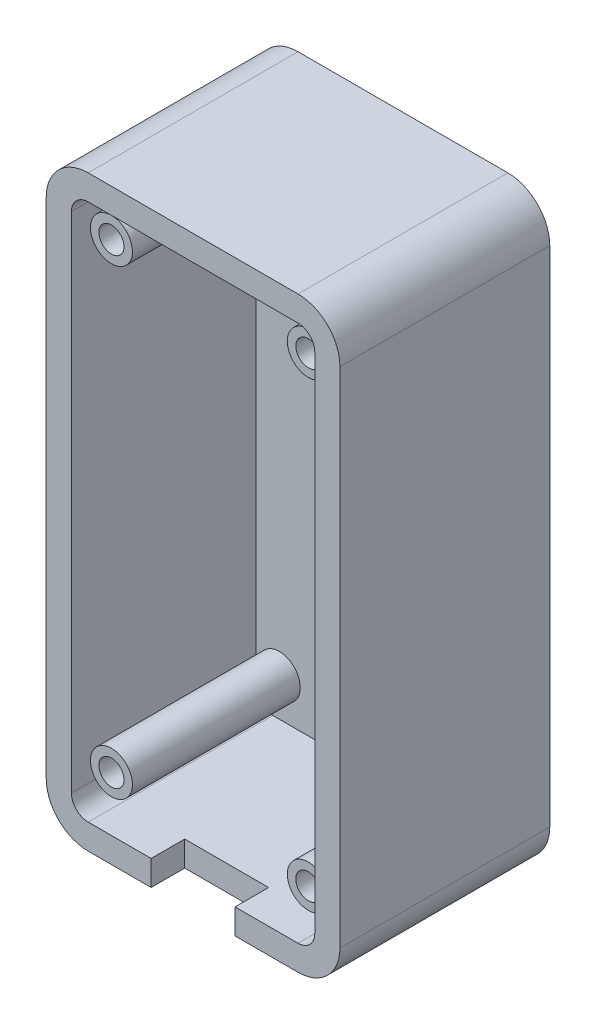
ISO-10303-21;
HEADER;
FILE_DESCRIPTION(('STEP AP214'),'2;1');
FILE_NAME('part.step','',(''),(''),'','','');
FILE_SCHEMA(('AUTOMOTIVE_DESIGN { 1 0 10303 214 1 1 1 1 }'));
ENDSEC;
DATA;
#1=APPLICATION_CONTEXT('core data for automotive mechanical design processes');
#2=APPLICATION_PROTOCOL_DEFINITION('international standard','automotive_design',2000,#1);
#3=PRODUCT_CONTEXT('',#1,'mechanical');
#4=PRODUCT('Part','Part','',(#3));
#5=PRODUCT_RELATED_PRODUCT_CATEGORY('part','',(#4));
#6=PRODUCT_DEFINITION_FORMATION('','',#4);
#7=PRODUCT_DEFINITION_CONTEXT('part definition',#1,'design');
#8=PRODUCT_DEFINITION('design','',#6,#7);
#9=PRODUCT_DEFINITION_SHAPE('','',#8);
#10=(LENGTH_UNIT() NAMED_UNIT(*) SI_UNIT(.MILLI.,.METRE.));
#11=(NAMED_UNIT(*) PLANE_ANGLE_UNIT() SI_UNIT($,.RADIAN.));
#12=(NAMED_UNIT(*) SI_UNIT($,.STERADIAN.) SOLID_ANGLE_UNIT());
#13=UNCERTAINTY_MEASURE_WITH_UNIT(LENGTH_MEASURE(1.E-05),#10,'distance_accuracy_value','');
#14=(GEOMETRIC_REPRESENTATION_CONTEXT(3) GLOBAL_UNCERTAINTY_ASSIGNED_CONTEXT((#13)) GLOBAL_UNIT_ASSIGNED_CONTEXT((#10,
#11,#12)) REPRESENTATION_CONTEXT('',''));
#15=CARTESIAN_POINT('',(0.,0.,0.));
#16=DIRECTION('',(0.,0.,1.));
#17=DIRECTION('',(1.,0.,0.));
#18=AXIS2_PLACEMENT_3D('',#15,#16,#17);
#19=CARTESIAN_POINT('',(-193.425196850394,0.,25.));
#20=DIRECTION('',(0.,1.,0.));
#21=DIRECTION('',(0.,0.,1.));
#22=AXIS2_PLACEMENT_3D('',#19,#20,#21);
#23=PLANE('',#22);
#24=DIRECTION('',(0.,0.,1.));
#25=VECTOR('',#24,1.);
#26=CARTESIAN_POINT('',(-175.925196850394,0.,25.));
#27=LINE('',#26,#25);
#28=CARTESIAN_POINT('',(-175.925196850394,0.,21.));
#29=VERTEX_POINT('',#28);
#30=CARTESIAN_POINT('',(-175.925196850394,0.,25.));
#31=VERTEX_POINT('',#30);
#32=EDGE_CURVE('E189',#29,#31,#27,.T.);
#33=ORIENTED_EDGE('',*,*,#32,.F.);
#34=DIRECTION('',(1.,0.,0.));
#35=VECTOR('',#34,1.);
#36=CARTESIAN_POINT('',(-193.425196850394,0.,21.));
#37=LINE('',#36,#35);
#38=CARTESIAN_POINT('',(-185.925196850394,0.,21.));
#39=VERTEX_POINT('',#38);
#40=EDGE_CURVE('E176',#39,#29,#37,.T.);
#41=ORIENTED_EDGE('',*,*,#40,.F.);
#42=DIRECTION('',(0.,0.,-1.));
#43=VECTOR('',#42,1.);
#44=CARTESIAN_POINT('',(-185.925196850394,0.,25.));
#45=LINE('',#44,#43);
#46=CARTESIAN_POINT('',(-185.925196850394,0.,25.));
#47=VERTEX_POINT('',#46);
#48=EDGE_CURVE('E169',#47,#39,#45,.T.);
#49=ORIENTED_EDGE('',*,*,#48,.F.);
#50=DIRECTION('',(1.,0.,0.));
#51=VECTOR('',#50,1.);
#52=CARTESIAN_POINT('',(-193.425196850394,0.,25.));
#53=LINE('',#52,#51);
#54=CARTESIAN_POINT('',(-193.425196850394,0.,25.));
#55=VERTEX_POINT('',#54);
#56=EDGE_CURVE('E295',#55,#47,#53,.T.);
#57=ORIENTED_EDGE('',*,*,#56,.F.);
#58=DIRECTION('',(0.,0.,-1.));
#59=VECTOR('',#58,1.);
#60=CARTESIAN_POINT('',(-193.425196850394,0.,25.));
#61=LINE('',#60,#59);
#62=CARTESIAN_POINT('',(-193.425196850394,0.,0.));
#63=VERTEX_POINT('',#62);
#64=EDGE_CURVE('E345',#55,#63,#61,.T.);
#65=ORIENTED_EDGE('',*,*,#64,.T.);
#66=DIRECTION('',(1.,0.,0.));
#67=VECTOR('',#66,1.);
#68=CARTESIAN_POINT('',(-193.425196850394,0.,0.));
#69=LINE('',#68,#67);
#70=CARTESIAN_POINT('',(-168.425196850394,0.,0.));
#71=VERTEX_POINT('',#70);
#72=EDGE_CURVE('E312',#63,#71,#69,.T.);
#73=ORIENTED_EDGE('',*,*,#72,.T.);
#74=DIRECTION('',(0.,0.,-1.));
#75=VECTOR('',#74,1.);
#76=CARTESIAN_POINT('',(-168.425196850394,0.,25.));
#77=LINE('',#76,#75);
#78=CARTESIAN_POINT('',(-168.425196850394,0.,25.));
#79=VERTEX_POINT('',#78);
#80=EDGE_CURVE('E342',#79,#71,#77,.T.);
#81=ORIENTED_EDGE('',*,*,#80,.F.);
#82=EDGE_CURVE('E293',#31,#79,#53,.T.);
#83=ORIENTED_EDGE('',*,*,#82,.F.);
#84=EDGE_LOOP('',(#33,#41,#49,#57,#65,#73,#81,#83));
#85=FACE_BOUND('',#84,.T.);
#86=ADVANCED_FACE('F33',(#85),#23,.F.);
#87=CARTESIAN_POINT('',(-193.425196850394,5.,25.));
#88=DIRECTION('',(0.,0.,1.));
#89=DIRECTION('',(1.,0.,0.));
#90=AXIS2_PLACEMENT_3D('',#87,#88,#89);
#91=PLANE('',#90);
#92=DIRECTION('',(1.,0.,0.));
#93=VECTOR('',#92,1.);
#94=CARTESIAN_POINT('',(-193.425196850394,3.,25.));
#95=LINE('',#94,#93);
#96=CARTESIAN_POINT('',(-175.925196850394,3.,25.));
#97=VERTEX_POINT('',#96);
#98=CARTESIAN_POINT('',(-168.425196850394,3.,25.));
#99=VERTEX_POINT('',#98);
#100=EDGE_CURVE('E275',#97,#99,#95,.T.);
#101=ORIENTED_EDGE('',*,*,#100,.F.);
#102=DIRECTION('',(0.,-1.,0.));
#103=VECTOR('',#102,1.);
#104=CARTESIAN_POINT('',(-175.925196850394,5.,25.));
#105=LINE('',#104,#103);
#106=EDGE_CURVE('E177',#97,#31,#105,.T.);
#107=ORIENTED_EDGE('',*,*,#106,.T.);
#108=ORIENTED_EDGE('',*,*,#82,.T.);
#109=CARTESIAN_POINT('',(-168.425196850394,5.,25.));
#110=DIRECTION('',(0.,0.,1.));
#111=DIRECTION('',(1.,0.,0.));
#112=AXIS2_PLACEMENT_3D('',#109,#110,#111);
#113=CIRCLE('',#112,5.);
#114=CARTESIAN_POINT('',(-163.425196850394,5.00000000000004,25.));
#115=VERTEX_POINT('',#114);
#116=EDGE_CURVE('E297',#79,#115,#113,.T.);
#117=ORIENTED_EDGE('',*,*,#116,.T.);
#118=DIRECTION('',(0.,1.,0.));
#119=VECTOR('',#118,1.);
#120=CARTESIAN_POINT('',(-163.425196850394,65.,25.));
#121=LINE('',#120,#119);
#122=CARTESIAN_POINT('',(-163.425196850394,65.,25.));
#123=VERTEX_POINT('',#122);
#124=EDGE_CURVE('E299',#115,#123,#121,.T.);
#125=ORIENTED_EDGE('',*,*,#124,.T.);
#126=CARTESIAN_POINT('',(-168.425196850394,65.,25.));
#127=DIRECTION('',(0.,0.,1.));
#128=DIRECTION('',(-1.,0.,0.));
#129=AXIS2_PLACEMENT_3D('',#126,#127,#128);
#130=CIRCLE('',#129,5.);
#131=CARTESIAN_POINT('',(-168.425196850394,70.,25.));
#132=VERTEX_POINT('',#131);
#133=EDGE_CURVE('E301',#123,#132,#130,.T.);
#134=ORIENTED_EDGE('',*,*,#133,.T.);
#135=DIRECTION('',(-1.,0.,0.));
#136=VECTOR('',#135,1.);
#137=CARTESIAN_POINT('',(-193.425196850394,70.,25.));
#138=LINE('',#137,#136);
#139=CARTESIAN_POINT('',(-193.425196850394,70.,25.));
#140=VERTEX_POINT('',#139);
#141=EDGE_CURVE('E303',#132,#140,#138,.T.);
#142=ORIENTED_EDGE('',*,*,#141,.T.);
#143=CARTESIAN_POINT('',(-193.425196850394,65.,25.));
#144=DIRECTION('',(0.,0.,1.));
#145=DIRECTION('',(1.,0.,0.));
#146=AXIS2_PLACEMENT_3D('',#143,#144,#145);
#147=CIRCLE('',#146,5.);
#148=CARTESIAN_POINT('',(-198.425196850394,65.,25.));
#149=VERTEX_POINT('',#148);
#150=EDGE_CURVE('E305',#140,#149,#147,.T.);
#151=ORIENTED_EDGE('',*,*,#150,.T.);
#152=DIRECTION('',(0.,-1.,0.));
#153=VECTOR('',#152,1.);
#154=CARTESIAN_POINT('',(-198.425196850394,65.,25.));
#155=LINE('',#154,#153);
#156=CARTESIAN_POINT('',(-198.425196850394,5.00000000000004,25.));
#157=VERTEX_POINT('',#156);
#158=EDGE_CURVE('E307',#149,#157,#155,.T.);
#159=ORIENTED_EDGE('',*,*,#158,.T.);
#160=CARTESIAN_POINT('',(-193.425196850394,5.,25.));
#161=DIRECTION('',(0.,0.,1.));
#162=DIRECTION('',(1.,0.,0.));
#163=AXIS2_PLACEMENT_3D('',#160,#161,#162);
#164=CIRCLE('',#163,5.);
#165=EDGE_CURVE('E290',#157,#55,#164,.T.);
#166=ORIENTED_EDGE('',*,*,#165,.T.);
#167=ORIENTED_EDGE('',*,*,#56,.T.);
#168=DIRECTION('',(0.,-1.,0.));
#169=VECTOR('',#168,1.);
#170=CARTESIAN_POINT('',(-185.925196850394,5.,25.));
#171=LINE('',#170,#169);
#172=CARTESIAN_POINT('',(-185.925196850394,3.,25.));
#173=VERTEX_POINT('',#172);
#174=EDGE_CURVE('E172',#173,#47,#171,.T.);
#175=ORIENTED_EDGE('',*,*,#174,.F.);
#176=CARTESIAN_POINT('',(-193.425196850394,3.,25.));
#177=VERTEX_POINT('',#176);
#178=EDGE_CURVE('E276',#177,#173,#95,.T.);
#179=ORIENTED_EDGE('',*,*,#178,.F.);
#180=CARTESIAN_POINT('',(-193.425196850394,5.,25.));
#181=DIRECTION('',(0.,0.,1.));
#182=DIRECTION('',(1.,0.,0.));
#183=AXIS2_PLACEMENT_3D('',#180,#181,#182);
#184=CIRCLE('',#183,2.);
#185=CARTESIAN_POINT('',(-195.425196850394,5.00000000000003,25.));
#186=VERTEX_POINT('',#185);
#187=EDGE_CURVE('E273',#186,#177,#184,.T.);
#188=ORIENTED_EDGE('',*,*,#187,.F.);
#189=DIRECTION('',(0.,-1.,0.));
#190=VECTOR('',#189,1.);
#191=CARTESIAN_POINT('',(-195.425196850394,65.,25.));
#192=LINE('',#191,#190);
#193=CARTESIAN_POINT('',(-195.425196850394,65.,25.));
#194=VERTEX_POINT('',#193);
#195=EDGE_CURVE('E244',#194,#186,#192,.T.);
#196=ORIENTED_EDGE('',*,*,#195,.F.);
#197=CARTESIAN_POINT('',(-193.425196850394,65.,25.));
#198=DIRECTION('',(0.,0.,1.));
#199=DIRECTION('',(1.,0.,0.));
#200=AXIS2_PLACEMENT_3D('',#197,#198,#199);
#201=CIRCLE('',#200,2.);
#202=CARTESIAN_POINT('',(-193.425196850394,67.,25.));
#203=VERTEX_POINT('',#202);
#204=EDGE_CURVE('E287',#203,#194,#201,.T.);
#205=ORIENTED_EDGE('',*,*,#204,.F.);
#206=DIRECTION('',(-1.,0.,0.));
#207=VECTOR('',#206,1.);
#208=CARTESIAN_POINT('',(-193.425196850394,67.,25.));
#209=LINE('',#208,#207);
#210=CARTESIAN_POINT('',(-168.425196850394,67.,25.));
#211=VERTEX_POINT('',#210);
#212=EDGE_CURVE('E285',#211,#203,#209,.T.);
#213=ORIENTED_EDGE('',*,*,#212,.F.);
#214=CARTESIAN_POINT('',(-168.425196850394,65.,25.));
#215=DIRECTION('',(0.,0.,1.));
#216=DIRECTION('',(1.,0.,0.));
#217=AXIS2_PLACEMENT_3D('',#214,#215,#216);
#218=CIRCLE('',#217,2.);
#219=CARTESIAN_POINT('',(-166.425196850394,65.,25.));
#220=VERTEX_POINT('',#219);
#221=EDGE_CURVE('E283',#220,#211,#218,.T.);
#222=ORIENTED_EDGE('',*,*,#221,.F.);
#223=DIRECTION('',(0.,1.,0.));
#224=VECTOR('',#223,1.);
#225=CARTESIAN_POINT('',(-166.425196850394,65.,25.));
#226=LINE('',#225,#224);
#227=CARTESIAN_POINT('',(-166.425196850394,5.00000000000001,25.));
#228=VERTEX_POINT('',#227);
#229=EDGE_CURVE('E281',#228,#220,#226,.T.);
#230=ORIENTED_EDGE('',*,*,#229,.F.);
#231=CARTESIAN_POINT('',(-168.425196850394,5.,25.));
#232=DIRECTION('',(0.,0.,1.));
#233=DIRECTION('',(1.,0.,0.));
#234=AXIS2_PLACEMENT_3D('',#231,#232,#233);
#235=CIRCLE('',#234,2.);
#236=EDGE_CURVE('E279',#99,#228,#235,.T.);
#237=ORIENTED_EDGE('',*,*,#236,.F.);
#238=EDGE_LOOP('',(#101,#107,#108,#117,#125,#134,#142,#151,#159,#166,#167,#175,#179,#188,#196,
#205,#213,#222,#230,#237));
#239=FACE_BOUND('',#238,.T.);
#240=ADVANCED_FACE('F365',(#239),#91,.T.);
#241=CARTESIAN_POINT('',(-193.425196850394,3.,25.));
#242=DIRECTION('',(0.,1.,0.));
#243=DIRECTION('',(0.,0.,1.));
#244=AXIS2_PLACEMENT_3D('',#241,#242,#243);
#245=PLANE('',#244);
#246=DIRECTION('',(1.,0.,0.));
#247=VECTOR('',#246,1.);
#248=CARTESIAN_POINT('',(-193.425196850394,3.,21.));
#249=LINE('',#248,#247);
#250=CARTESIAN_POINT('',(-185.925196850394,3.,21.));
#251=VERTEX_POINT('',#250);
#252=CARTESIAN_POINT('',(-175.925196850394,3.,21.));
#253=VERTEX_POINT('',#252);
#254=EDGE_CURVE('E41',#251,#253,#249,.T.);
#255=ORIENTED_EDGE('',*,*,#254,.T.);
#256=DIRECTION('',(0.,0.,1.));
#257=VECTOR('',#256,1.);
#258=CARTESIAN_POINT('',(-175.925196850394,3.,25.));
#259=LINE('',#258,#257);
#260=EDGE_CURVE('E11',#253,#97,#259,.T.);
#261=ORIENTED_EDGE('',*,*,#260,.T.);
#262=ORIENTED_EDGE('',*,*,#100,.T.);
#263=DIRECTION('',(0.,0.,-1.));
#264=VECTOR('',#263,1.);
#265=CARTESIAN_POINT('',(-168.425196850394,3.,25.));
#266=LINE('',#265,#264);
#267=CARTESIAN_POINT('',(-168.425196850394,3.,3.));
#268=VERTEX_POINT('',#267);
#269=EDGE_CURVE('E240',#99,#268,#266,.T.);
#270=ORIENTED_EDGE('',*,*,#269,.T.);
#271=DIRECTION('',(1.,0.,0.));
#272=VECTOR('',#271,1.);
#273=CARTESIAN_POINT('',(-193.425196850394,3.,3.));
#274=LINE('',#273,#272);
#275=CARTESIAN_POINT('',(-193.425196850394,3.,3.));
#276=VERTEX_POINT('',#275);
#277=EDGE_CURVE('E235',#276,#268,#274,.T.);
#278=ORIENTED_EDGE('',*,*,#277,.F.);
#279=DIRECTION('',(0.,0.,1.));
#280=VECTOR('',#279,1.);
#281=CARTESIAN_POINT('',(-193.425196850394,3.,25.));
#282=LINE('',#281,#280);
#283=EDGE_CURVE('E236',#177,#276,#282,.F.);
#284=ORIENTED_EDGE('',*,*,#283,.F.);
#285=ORIENTED_EDGE('',*,*,#178,.T.);
#286=DIRECTION('',(0.,0.,-1.));
#287=VECTOR('',#286,1.);
#288=CARTESIAN_POINT('',(-185.925196850394,3.,25.));
#289=LINE('',#288,#287);
#290=EDGE_CURVE('E348',#173,#251,#289,.T.);
#291=ORIENTED_EDGE('',*,*,#290,.T.);
#292=EDGE_LOOP('',(#255,#261,#262,#270,#278,#284,#285,#291));
#293=FACE_BOUND('',#292,.T.);
#294=ADVANCED_FACE('F360',(#293),#245,.T.);
#295=CARTESIAN_POINT('',(-193.425196850394,5.,25.));
#296=DIRECTION('',(0.,0.,-1.));
#297=DIRECTION('',(-1.,0.,0.));
#298=AXIS2_PLACEMENT_3D('',#295,#296,#297);
#299=CYLINDRICAL_SURFACE('',#298,5.);
#300=CARTESIAN_POINT('',(-193.425196850394,5.,0.));
#301=DIRECTION('',(0.,0.,1.));
#302=DIRECTION('',(1.,0.,0.));
#303=AXIS2_PLACEMENT_3D('',#300,#301,#302);
#304=CIRCLE('',#303,5.);
#305=CARTESIAN_POINT('',(-198.425196850394,5.00000000000004,0.));
#306=VERTEX_POINT('',#305);
#307=EDGE_CURVE('E239',#306,#63,#304,.T.);
#308=ORIENTED_EDGE('',*,*,#307,.T.);
#309=ORIENTED_EDGE('',*,*,#64,.F.);
#310=ORIENTED_EDGE('',*,*,#165,.F.);
#311=DIRECTION('',(0.,0.,-1.));
#312=VECTOR('',#311,1.);
#313=CARTESIAN_POINT('',(-198.425196850394,5.00000000000004,25.));
#314=LINE('',#313,#312);
#315=EDGE_CURVE('E309',#157,#306,#314,.T.);
#316=ORIENTED_EDGE('',*,*,#315,.T.);
#317=EDGE_LOOP('',(#308,#309,#310,#316));
#318=FACE_BOUND('',#317,.T.);
#319=ADVANCED_FACE('F35',(#318),#299,.T.);
#320=CARTESIAN_POINT('',(-168.425196850394,5.,25.));
#321=DIRECTION('',(0.,0.,-1.));
#322=DIRECTION('',(-1.,0.,0.));
#323=AXIS2_PLACEMENT_3D('',#320,#321,#322);
#324=CYLINDRICAL_SURFACE('',#323,5.);
#325=CARTESIAN_POINT('',(-168.425196850394,5.,0.));
#326=DIRECTION('',(0.,0.,1.));
#327=DIRECTION('',(1.,0.,0.));
#328=AXIS2_PLACEMENT_3D('',#325,#326,#327);
#329=CIRCLE('',#328,5.);
#330=CARTESIAN_POINT('',(-163.425196850394,5.00000000000004,0.));
#331=VERTEX_POINT('',#330);
#332=EDGE_CURVE('E314',#71,#331,#329,.T.);
#333=ORIENTED_EDGE('',*,*,#332,.T.);
#334=DIRECTION('',(0.,0.,-1.));
#335=VECTOR('',#334,1.);
#336=CARTESIAN_POINT('',(-163.425196850394,5.00000000000004,25.));
#337=LINE('',#336,#335);
#338=EDGE_CURVE('E339',#115,#331,#337,.T.);
#339=ORIENTED_EDGE('',*,*,#338,.F.);
#340=ORIENTED_EDGE('',*,*,#116,.F.);
#341=ORIENTED_EDGE('',*,*,#80,.T.);
#342=EDGE_LOOP('',(#333,#339,#340,#341));
#343=FACE_BOUND('',#342,.T.);
#344=ADVANCED_FACE('F377',(#343),#324,.T.);
#345=CARTESIAN_POINT('',(-163.425196850394,65.,25.));
#346=DIRECTION('',(-1.,0.,0.));
#347=DIRECTION('',(0.,-1.,0.));
#348=AXIS2_PLACEMENT_3D('',#345,#346,#347);
#349=PLANE('',#348);
#350=DIRECTION('',(0.,1.,0.));
#351=VECTOR('',#350,1.);
#352=CARTESIAN_POINT('',(-163.425196850394,65.,0.));
#353=LINE('',#352,#351);
#354=CARTESIAN_POINT('',(-163.425196850394,65.,0.));
#355=VERTEX_POINT('',#354);
#356=EDGE_CURVE('E316',#331,#355,#353,.T.);
#357=ORIENTED_EDGE('',*,*,#356,.T.);
#358=DIRECTION('',(0.,0.,-1.));
#359=VECTOR('',#358,1.);
#360=CARTESIAN_POINT('',(-163.425196850394,65.,25.));
#361=LINE('',#360,#359);
#362=EDGE_CURVE('E336',#123,#355,#361,.T.);
#363=ORIENTED_EDGE('',*,*,#362,.F.);
#364=ORIENTED_EDGE('',*,*,#124,.F.);
#365=ORIENTED_EDGE('',*,*,#338,.T.);
#366=EDGE_LOOP('',(#357,#363,#364,#365));
#367=FACE_BOUND('',#366,.T.);
#368=ADVANCED_FACE('F383',(#367),#349,.F.);
#369=CARTESIAN_POINT('',(-168.425196850394,65.,25.));
#370=DIRECTION('',(0.,0.,-1.));
#371=DIRECTION('',(-1.,0.,0.));
#372=AXIS2_PLACEMENT_3D('',#369,#370,#371);
#373=CYLINDRICAL_SURFACE('',#372,5.);
#374=CARTESIAN_POINT('',(-168.425196850394,65.,0.));
#375=DIRECTION('',(0.,0.,1.));
#376=DIRECTION('',(-1.,0.,0.));
#377=AXIS2_PLACEMENT_3D('',#374,#375,#376);
#378=CIRCLE('',#377,5.);
#379=CARTESIAN_POINT('',(-168.425196850394,70.,0.));
#380=VERTEX_POINT('',#379);
#381=EDGE_CURVE('E318',#355,#380,#378,.T.);
#382=ORIENTED_EDGE('',*,*,#381,.T.);
#383=DIRECTION('',(0.,0.,-1.));
#384=VECTOR('',#383,1.);
#385=CARTESIAN_POINT('',(-168.425196850394,70.,25.));
#386=LINE('',#385,#384);
#387=EDGE_CURVE('E333',#132,#380,#386,.T.);
#388=ORIENTED_EDGE('',*,*,#387,.F.);
#389=ORIENTED_EDGE('',*,*,#133,.F.);
#390=ORIENTED_EDGE('',*,*,#362,.T.);
#391=EDGE_LOOP('',(#382,#388,#389,#390));
#392=FACE_BOUND('',#391,.T.);
#393=ADVANCED_FACE('F387',(#392),#373,.T.);
#394=CARTESIAN_POINT('',(-193.425196850394,70.,25.));
#395=DIRECTION('',(0.,-1.,0.));
#396=DIRECTION('',(0.,0.,-1.));
#397=AXIS2_PLACEMENT_3D('',#394,#395,#396);
#398=PLANE('',#397);
#399=DIRECTION('',(-1.,0.,0.));
#400=VECTOR('',#399,1.);
#401=CARTESIAN_POINT('',(-193.425196850394,70.,0.));
#402=LINE('',#401,#400);
#403=CARTESIAN_POINT('',(-193.425196850394,70.,0.));
#404=VERTEX_POINT('',#403);
#405=EDGE_CURVE('E320',#380,#404,#402,.T.);
#406=ORIENTED_EDGE('',*,*,#405,.T.);
#407=DIRECTION('',(0.,0.,-1.));
#408=VECTOR('',#407,1.);
#409=CARTESIAN_POINT('',(-193.425196850394,70.,25.));
#410=LINE('',#409,#408);
#411=EDGE_CURVE('E330',#140,#404,#410,.T.);
#412=ORIENTED_EDGE('',*,*,#411,.F.);
#413=ORIENTED_EDGE('',*,*,#141,.F.);
#414=ORIENTED_EDGE('',*,*,#387,.T.);
#415=EDGE_LOOP('',(#406,#412,#413,#414));
#416=FACE_BOUND('',#415,.T.);
#417=ADVANCED_FACE('F392',(#416),#398,.F.);
#418=CARTESIAN_POINT('',(-193.425196850394,65.,25.));
#419=DIRECTION('',(0.,0.,-1.));
#420=DIRECTION('',(-1.,0.,0.));
#421=AXIS2_PLACEMENT_3D('',#418,#419,#420);
#422=CYLINDRICAL_SURFACE('',#421,5.);
#423=CARTESIAN_POINT('',(-193.425196850394,65.,0.));
#424=DIRECTION('',(0.,0.,1.));
#425=DIRECTION('',(1.,0.,0.));
#426=AXIS2_PLACEMENT_3D('',#423,#424,#425);
#427=CIRCLE('',#426,5.);
#428=CARTESIAN_POINT('',(-198.425196850394,65.,0.));
#429=VERTEX_POINT('',#428);
#430=EDGE_CURVE('E322',#404,#429,#427,.T.);
#431=ORIENTED_EDGE('',*,*,#430,.T.);
#432=DIRECTION('',(0.,0.,-1.));
#433=VECTOR('',#432,1.);
#434=CARTESIAN_POINT('',(-198.425196850394,65.,25.));
#435=LINE('',#434,#433);
#436=EDGE_CURVE('E327',#149,#429,#435,.T.);
#437=ORIENTED_EDGE('',*,*,#436,.F.);
#438=ORIENTED_EDGE('',*,*,#150,.F.);
#439=ORIENTED_EDGE('',*,*,#411,.T.);
#440=EDGE_LOOP('',(#431,#437,#438,#439));
#441=FACE_BOUND('',#440,.T.);
#442=ADVANCED_FACE('F398',(#441),#422,.T.);
#443=CARTESIAN_POINT('',(-198.425196850394,65.,25.));
#444=DIRECTION('',(1.,0.,0.));
#445=DIRECTION('',(0.,0.,-1.));
#446=AXIS2_PLACEMENT_3D('',#443,#444,#445);
#447=PLANE('',#446);
#448=DIRECTION('',(0.,-1.,0.));
#449=VECTOR('',#448,1.);
#450=CARTESIAN_POINT('',(-198.425196850394,65.,0.));
#451=LINE('',#450,#449);
#452=EDGE_CURVE('E294',#429,#306,#451,.T.);
#453=ORIENTED_EDGE('',*,*,#452,.T.);
#454=ORIENTED_EDGE('',*,*,#315,.F.);
#455=ORIENTED_EDGE('',*,*,#158,.F.);
#456=ORIENTED_EDGE('',*,*,#436,.T.);
#457=EDGE_LOOP('',(#453,#454,#455,#456));
#458=FACE_BOUND('',#457,.T.);
#459=ADVANCED_FACE('F402',(#458),#447,.F.);
#460=CARTESIAN_POINT('',(-193.425196850394,5.,0.));
#461=DIRECTION('',(0.,0.,1.));
#462=DIRECTION('',(1.,0.,0.));
#463=AXIS2_PLACEMENT_3D('',#460,#461,#462);
#464=PLANE('',#463);
#465=CARTESIAN_POINT('',(-192.65673945571,7.5,0.));
#466=DIRECTION('',(0.,0.,1.));
#467=DIRECTION('',(1.,0.,0.));
#468=AXIS2_PLACEMENT_3D('',#465,#466,#467);
#469=CIRCLE('',#468,1.5);
#470=CARTESIAN_POINT('',(-191.15673945571,7.5,0.));
#471=VERTEX_POINT('',#470);
#472=EDGE_CURVE('E191',#471,#471,#469,.T.);
#473=ORIENTED_EDGE('',*,*,#472,.T.);
#474=EDGE_LOOP('',(#473));
#475=FACE_BOUND('',#474,.T.);
#476=CARTESIAN_POINT('',(-169.193654245077,7.5,0.));
#477=DIRECTION('',(0.,0.,1.));
#478=DIRECTION('',(1.,0.,0.));
#479=AXIS2_PLACEMENT_3D('',#476,#477,#478);
#480=CIRCLE('',#479,1.5);
#481=CARTESIAN_POINT('',(-167.693654245077,7.5,0.));
#482=VERTEX_POINT('',#481);
#483=EDGE_CURVE('E199',#482,#482,#480,.T.);
#484=ORIENTED_EDGE('',*,*,#483,.T.);
#485=EDGE_LOOP('',(#484));
#486=FACE_BOUND('',#485,.T.);
#487=CARTESIAN_POINT('',(-169.193654245077,62.5,0.));
#488=DIRECTION('',(0.,0.,1.));
#489=DIRECTION('',(1.,0.,0.));
#490=AXIS2_PLACEMENT_3D('',#487,#488,#489);
#491=CIRCLE('',#490,1.5);
#492=CARTESIAN_POINT('',(-167.693654245077,62.5,0.));
#493=VERTEX_POINT('',#492);
#494=EDGE_CURVE('E195',#493,#493,#491,.T.);
#495=ORIENTED_EDGE('',*,*,#494,.T.);
#496=EDGE_LOOP('',(#495));
#497=FACE_BOUND('',#496,.T.);
#498=CARTESIAN_POINT('',(-192.65673945571,62.5,0.));
#499=DIRECTION('',(0.,0.,1.));
#500=DIRECTION('',(1.,0.,0.));
#501=AXIS2_PLACEMENT_3D('',#498,#499,#500);
#502=CIRCLE('',#501,1.5);
#503=CARTESIAN_POINT('',(-191.15673945571,62.5,0.));
#504=VERTEX_POINT('',#503);
#505=EDGE_CURVE('E198',#504,#504,#502,.T.);
#506=ORIENTED_EDGE('',*,*,#505,.T.);
#507=EDGE_LOOP('',(#506));
#508=FACE_BOUND('',#507,.T.);
#509=ORIENTED_EDGE('',*,*,#307,.F.);
#510=ORIENTED_EDGE('',*,*,#452,.F.);
#511=ORIENTED_EDGE('',*,*,#430,.F.);
#512=ORIENTED_EDGE('',*,*,#405,.F.);
#513=ORIENTED_EDGE('',*,*,#381,.F.);
#514=ORIENTED_EDGE('',*,*,#356,.F.);
#515=ORIENTED_EDGE('',*,*,#332,.F.);
#516=ORIENTED_EDGE('',*,*,#72,.F.);
#517=EDGE_LOOP('',(#509,#510,#511,#512,#513,#514,#515,#516));
#518=FACE_BOUND('',#517,.T.);
#519=ADVANCED_FACE('F408',(#475,#486,#497,#508,#518),#464,.F.);
#520=CARTESIAN_POINT('',(-193.425196850394,5.,25.));
#521=DIRECTION('',(0.,0.,-1.));
#522=DIRECTION('',(-1.,0.,0.));
#523=AXIS2_PLACEMENT_3D('',#520,#521,#522);
#524=CYLINDRICAL_SURFACE('',#523,2.);
#525=CARTESIAN_POINT('',(-193.425196850394,5.,3.));
#526=DIRECTION('',(0.,0.,1.));
#527=DIRECTION('',(1.,0.,0.));
#528=AXIS2_PLACEMENT_3D('',#525,#526,#527);
#529=CIRCLE('',#528,2.);
#530=CARTESIAN_POINT('',(-195.425196850394,5.00000000000001,3.));
#531=VERTEX_POINT('',#530);
#532=EDGE_CURVE('E230',#531,#276,#529,.T.);
#533=ORIENTED_EDGE('',*,*,#532,.F.);
#534=DIRECTION('',(0.,0.,-1.));
#535=VECTOR('',#534,1.);
#536=CARTESIAN_POINT('',(-195.425196850394,5.00000000000001,25.));
#537=LINE('',#536,#535);
#538=EDGE_CURVE('E241',#186,#531,#537,.T.);
#539=ORIENTED_EDGE('',*,*,#538,.F.);
#540=ORIENTED_EDGE('',*,*,#187,.T.);
#541=ORIENTED_EDGE('',*,*,#283,.T.);
#542=EDGE_LOOP('',(#533,#539,#540,#541));
#543=FACE_BOUND('',#542,.T.);
#544=ADVANCED_FACE('F410',(#543),#524,.F.);
#545=CARTESIAN_POINT('',(-168.425196850394,5.,25.));
#546=DIRECTION('',(0.,0.,-1.));
#547=DIRECTION('',(-1.,0.,0.));
#548=AXIS2_PLACEMENT_3D('',#545,#546,#547);
#549=CYLINDRICAL_SURFACE('',#548,2.);
#550=CARTESIAN_POINT('',(-168.425196850394,5.,3.));
#551=DIRECTION('',(0.,0.,1.));
#552=DIRECTION('',(1.,0.,0.));
#553=AXIS2_PLACEMENT_3D('',#550,#551,#552);
#554=CIRCLE('',#553,2.);
#555=CARTESIAN_POINT('',(-166.425196850394,5.00000000000003,3.));
#556=VERTEX_POINT('',#555);
#557=EDGE_CURVE('E246',#268,#556,#554,.T.);
#558=ORIENTED_EDGE('',*,*,#557,.F.);
#559=ORIENTED_EDGE('',*,*,#269,.F.);
#560=ORIENTED_EDGE('',*,*,#236,.T.);
#561=DIRECTION('',(0.,0.,1.));
#562=VECTOR('',#561,1.);
#563=CARTESIAN_POINT('',(-166.425196850394,5.00000000000003,25.));
#564=LINE('',#563,#562);
#565=EDGE_CURVE('E249',#228,#556,#564,.F.);
#566=ORIENTED_EDGE('',*,*,#565,.T.);
#567=EDGE_LOOP('',(#558,#559,#560,#566));
#568=FACE_BOUND('',#567,.T.);
#569=ADVANCED_FACE('F417',(#568),#549,.F.);
#570=CARTESIAN_POINT('',(-166.425196850394,65.,25.));
#571=DIRECTION('',(-1.,0.,0.));
#572=DIRECTION('',(0.,-1.,0.));
#573=AXIS2_PLACEMENT_3D('',#570,#571,#572);
#574=PLANE('',#573);
#575=DIRECTION('',(0.,1.,0.));
#576=VECTOR('',#575,1.);
#577=CARTESIAN_POINT('',(-166.425196850394,65.,3.));
#578=LINE('',#577,#576);
#579=CARTESIAN_POINT('',(-166.425196850394,65.,3.));
#580=VERTEX_POINT('',#579);
#581=EDGE_CURVE('E251',#556,#580,#578,.T.);
#582=ORIENTED_EDGE('',*,*,#581,.F.);
#583=ORIENTED_EDGE('',*,*,#565,.F.);
#584=ORIENTED_EDGE('',*,*,#229,.T.);
#585=DIRECTION('',(0.,0.,-1.));
#586=VECTOR('',#585,1.);
#587=CARTESIAN_POINT('',(-166.425196850394,65.,25.));
#588=LINE('',#587,#586);
#589=EDGE_CURVE('E254',#220,#580,#588,.T.);
#590=ORIENTED_EDGE('',*,*,#589,.T.);
#591=EDGE_LOOP('',(#582,#583,#584,#590));
#592=FACE_BOUND('',#591,.T.);
#593=ADVANCED_FACE('F462',(#592),#574,.T.);
#594=CARTESIAN_POINT('',(-168.425196850394,65.,25.));
#595=DIRECTION('',(0.,0.,-1.));
#596=DIRECTION('',(-1.,0.,0.));
#597=AXIS2_PLACEMENT_3D('',#594,#595,#596);
#598=CYLINDRICAL_SURFACE('',#597,2.);
#599=CARTESIAN_POINT('',(-168.425196850394,65.,3.));
#600=DIRECTION('',(0.,0.,1.));
#601=DIRECTION('',(1.,0.,0.));
#602=AXIS2_PLACEMENT_3D('',#599,#600,#601);
#603=CIRCLE('',#602,2.);
#604=CARTESIAN_POINT('',(-168.425196850394,67.,3.));
#605=VERTEX_POINT('',#604);
#606=EDGE_CURVE('E256',#580,#605,#603,.T.);
#607=ORIENTED_EDGE('',*,*,#606,.F.);
#608=ORIENTED_EDGE('',*,*,#589,.F.);
#609=ORIENTED_EDGE('',*,*,#221,.T.);
#610=DIRECTION('',(0.,0.,-1.));
#611=VECTOR('',#610,1.);
#612=CARTESIAN_POINT('',(-168.425196850394,67.,25.));
#613=LINE('',#612,#611);
#614=EDGE_CURVE('E259',#211,#605,#613,.T.);
#615=ORIENTED_EDGE('',*,*,#614,.T.);
#616=EDGE_LOOP('',(#607,#608,#609,#615));
#617=FACE_BOUND('',#616,.T.);
#618=ADVANCED_FACE('F472',(#617),#598,.F.);
#619=CARTESIAN_POINT('',(-193.425196850394,67.,25.));
#620=DIRECTION('',(0.,-1.,0.));
#621=DIRECTION('',(0.,0.,-1.));
#622=AXIS2_PLACEMENT_3D('',#619,#620,#621);
#623=PLANE('',#622);
#624=DIRECTION('',(-1.,0.,0.));
#625=VECTOR('',#624,1.);
#626=CARTESIAN_POINT('',(-193.425196850394,67.,3.));
#627=LINE('',#626,#625);
#628=CARTESIAN_POINT('',(-193.425196850394,67.,3.));
#629=VERTEX_POINT('',#628);
#630=EDGE_CURVE('E261',#605,#629,#627,.T.);
#631=ORIENTED_EDGE('',*,*,#630,.F.);
#632=ORIENTED_EDGE('',*,*,#614,.F.);
#633=ORIENTED_EDGE('',*,*,#212,.T.);
#634=DIRECTION('',(0.,0.,-1.));
#635=VECTOR('',#634,1.);
#636=CARTESIAN_POINT('',(-193.425196850394,67.,25.));
#637=LINE('',#636,#635);
#638=EDGE_CURVE('E264',#203,#629,#637,.T.);
#639=ORIENTED_EDGE('',*,*,#638,.T.);
#640=EDGE_LOOP('',(#631,#632,#633,#639));
#641=FACE_BOUND('',#640,.T.);
#642=ADVANCED_FACE('F482',(#641),#623,.T.);
#643=CARTESIAN_POINT('',(-193.425196850394,65.,25.));
#644=DIRECTION('',(0.,0.,-1.));
#645=DIRECTION('',(-1.,0.,0.));
#646=AXIS2_PLACEMENT_3D('',#643,#644,#645);
#647=CYLINDRICAL_SURFACE('',#646,2.);
#648=CARTESIAN_POINT('',(-193.425196850394,65.,3.));
#649=DIRECTION('',(0.,0.,1.));
#650=DIRECTION('',(1.,0.,0.));
#651=AXIS2_PLACEMENT_3D('',#648,#649,#650);
#652=CIRCLE('',#651,2.);
#653=CARTESIAN_POINT('',(-195.425196850394,65.,3.));
#654=VERTEX_POINT('',#653);
#655=EDGE_CURVE('E266',#629,#654,#652,.T.);
#656=ORIENTED_EDGE('',*,*,#655,.F.);
#657=ORIENTED_EDGE('',*,*,#638,.F.);
#658=ORIENTED_EDGE('',*,*,#204,.T.);
#659=DIRECTION('',(0.,0.,-1.));
#660=VECTOR('',#659,1.);
#661=CARTESIAN_POINT('',(-195.425196850394,65.,25.));
#662=LINE('',#661,#660);
#663=EDGE_CURVE('E56',#194,#654,#662,.T.);
#664=ORIENTED_EDGE('',*,*,#663,.T.);
#665=EDGE_LOOP('',(#656,#657,#658,#664));
#666=FACE_BOUND('',#665,.T.);
#667=ADVANCED_FACE('F492',(#666),#647,.F.);
#668=CARTESIAN_POINT('',(-195.425196850394,65.,25.));
#669=DIRECTION('',(1.,0.,0.));
#670=DIRECTION('',(0.,0.,-1.));
#671=AXIS2_PLACEMENT_3D('',#668,#669,#670);
#672=PLANE('',#671);
#673=DIRECTION('',(0.,-1.,0.));
#674=VECTOR('',#673,1.);
#675=CARTESIAN_POINT('',(-195.425196850394,65.,3.));
#676=LINE('',#675,#674);
#677=EDGE_CURVE('E270',#654,#531,#676,.T.);
#678=ORIENTED_EDGE('',*,*,#677,.F.);
#679=ORIENTED_EDGE('',*,*,#663,.F.);
#680=ORIENTED_EDGE('',*,*,#195,.T.);
#681=ORIENTED_EDGE('',*,*,#538,.T.);
#682=EDGE_LOOP('',(#678,#679,#680,#681));
#683=FACE_BOUND('',#682,.T.);
#684=ADVANCED_FACE('F502',(#683),#672,.T.);
#685=CARTESIAN_POINT('',(-193.425196850394,5.,3.));
#686=DIRECTION('',(0.,0.,1.));
#687=DIRECTION('',(1.,0.,0.));
#688=AXIS2_PLACEMENT_3D('',#685,#686,#687);
#689=PLANE('',#688);
#690=CARTESIAN_POINT('',(-169.193654245077,7.5,3.));
#691=DIRECTION('',(0.,0.,1.));
#692=DIRECTION('',(1.,0.,0.));
#693=AXIS2_PLACEMENT_3D('',#690,#691,#692);
#694=CIRCLE('',#693,2.5);
#695=CARTESIAN_POINT('',(-166.693654245077,7.5,3.));
#696=VERTEX_POINT('',#695);
#697=EDGE_CURVE('E211',#696,#696,#694,.T.);
#698=ORIENTED_EDGE('',*,*,#697,.F.);
#699=EDGE_LOOP('',(#698));
#700=FACE_BOUND('',#699,.T.);
#701=CARTESIAN_POINT('',(-169.193654245077,62.5,3.));
#702=DIRECTION('',(0.,0.,1.));
#703=DIRECTION('',(1.,0.,0.));
#704=AXIS2_PLACEMENT_3D('',#701,#702,#703);
#705=CIRCLE('',#704,2.5);
#706=CARTESIAN_POINT('',(-166.693654245077,62.5,3.));
#707=VERTEX_POINT('',#706);
#708=EDGE_CURVE('E210',#707,#707,#705,.T.);
#709=ORIENTED_EDGE('',*,*,#708,.F.);
#710=EDGE_LOOP('',(#709));
#711=FACE_BOUND('',#710,.T.);
#712=CARTESIAN_POINT('',(-192.65673945571,7.5,3.));
#713=DIRECTION('',(0.,0.,1.));
#714=DIRECTION('',(1.,0.,0.));
#715=AXIS2_PLACEMENT_3D('',#712,#713,#714);
#716=CIRCLE('',#715,2.5);
#717=CARTESIAN_POINT('',(-190.15673945571,7.5,3.));
#718=VERTEX_POINT('',#717);
#719=EDGE_CURVE('E218',#718,#718,#716,.T.);
#720=ORIENTED_EDGE('',*,*,#719,.F.);
#721=EDGE_LOOP('',(#720));
#722=FACE_BOUND('',#721,.T.);
#723=CARTESIAN_POINT('',(-192.65673945571,62.5,3.));
#724=DIRECTION('',(0.,0.,1.));
#725=DIRECTION('',(1.,0.,0.));
#726=AXIS2_PLACEMENT_3D('',#723,#724,#725);
#727=CIRCLE('',#726,2.5);
#728=CARTESIAN_POINT('',(-190.15673945571,62.5,3.));
#729=VERTEX_POINT('',#728);
#730=EDGE_CURVE('E224',#729,#729,#727,.T.);
#731=ORIENTED_EDGE('',*,*,#730,.F.);
#732=EDGE_LOOP('',(#731));
#733=FACE_BOUND('',#732,.T.);
#734=ORIENTED_EDGE('',*,*,#532,.T.);
#735=ORIENTED_EDGE('',*,*,#277,.T.);
#736=ORIENTED_EDGE('',*,*,#557,.T.);
#737=ORIENTED_EDGE('',*,*,#581,.T.);
#738=ORIENTED_EDGE('',*,*,#606,.T.);
#739=ORIENTED_EDGE('',*,*,#630,.T.);
#740=ORIENTED_EDGE('',*,*,#655,.T.);
#741=ORIENTED_EDGE('',*,*,#677,.T.);
#742=EDGE_LOOP('',(#734,#735,#736,#737,#738,#739,#740,#741));
#743=FACE_BOUND('',#742,.T.);
#744=ADVANCED_FACE('F512',(#700,#711,#722,#733,#743),#689,.T.);
#745=CARTESIAN_POINT('',(-192.65673945571,62.5,23.));
#746=DIRECTION('',(0.,0.,-1.));
#747=DIRECTION('',(-1.,0.,0.));
#748=AXIS2_PLACEMENT_3D('',#745,#746,#747);
#749=CYLINDRICAL_SURFACE('',#748,2.5);
#750=CARTESIAN_POINT('',(-192.65673945571,62.5,23.));
#751=DIRECTION('',(0.,0.,1.));
#752=DIRECTION('',(1.,0.,0.));
#753=AXIS2_PLACEMENT_3D('',#750,#751,#752);
#754=CIRCLE('',#753,2.5);
#755=CARTESIAN_POINT('',(-190.15673945571,62.5,23.));
#756=VERTEX_POINT('',#755);
#757=EDGE_CURVE('E227',#756,#756,#754,.T.);
#758=ORIENTED_EDGE('',*,*,#757,.F.);
#759=EDGE_LOOP('',(#758));
#760=FACE_BOUND('',#759,.T.);
#761=ORIENTED_EDGE('',*,*,#730,.T.);
#762=EDGE_LOOP('',(#761));
#763=FACE_BOUND('',#762,.T.);
#764=ADVANCED_FACE('F521',(#760,#763),#749,.T.);
#765=CARTESIAN_POINT('',(-192.65673945571,62.5,23.));
#766=DIRECTION('',(0.,0.,1.));
#767=DIRECTION('',(1.,0.,0.));
#768=AXIS2_PLACEMENT_3D('',#765,#766,#767);
#769=PLANE('',#768);
#770=CARTESIAN_POINT('',(-192.65673945571,62.5,23.));
#771=DIRECTION('',(0.,0.,1.));
#772=DIRECTION('',(1.,0.,0.));
#773=AXIS2_PLACEMENT_3D('',#770,#771,#772);
#774=CIRCLE('',#773,1.5);
#775=CARTESIAN_POINT('',(-191.15673945571,62.5,23.));
#776=VERTEX_POINT('',#775);
#777=EDGE_CURVE('E214',#776,#776,#774,.T.);
#778=ORIENTED_EDGE('',*,*,#777,.F.);
#779=EDGE_LOOP('',(#778));
#780=FACE_BOUND('',#779,.T.);
#781=ORIENTED_EDGE('',*,*,#757,.T.);
#782=EDGE_LOOP('',(#781));
#783=FACE_BOUND('',#782,.T.);
#784=ADVANCED_FACE('F531',(#780,#783),#769,.T.);
#785=CARTESIAN_POINT('',(-192.65673945571,7.5,23.));
#786=DIRECTION('',(0.,0.,-1.));
#787=DIRECTION('',(-1.,0.,0.));
#788=AXIS2_PLACEMENT_3D('',#785,#786,#787);
#789=CYLINDRICAL_SURFACE('',#788,2.5);
#790=CARTESIAN_POINT('',(-192.65673945571,7.5,23.));
#791=DIRECTION('',(0.,0.,1.));
#792=DIRECTION('',(1.,0.,0.));
#793=AXIS2_PLACEMENT_3D('',#790,#791,#792);
#794=CIRCLE('',#793,2.5);
#795=CARTESIAN_POINT('',(-190.15673945571,7.5,23.));
#796=VERTEX_POINT('',#795);
#797=EDGE_CURVE('E221',#796,#796,#794,.T.);
#798=ORIENTED_EDGE('',*,*,#797,.F.);
#799=EDGE_LOOP('',(#798));
#800=FACE_BOUND('',#799,.T.);
#801=ORIENTED_EDGE('',*,*,#719,.T.);
#802=EDGE_LOOP('',(#801));
#803=FACE_BOUND('',#802,.T.);
#804=ADVANCED_FACE('F539',(#800,#803),#789,.T.);
#805=CARTESIAN_POINT('',(-192.65673945571,7.5,23.));
#806=DIRECTION('',(0.,0.,1.));
#807=DIRECTION('',(1.,0.,0.));
#808=AXIS2_PLACEMENT_3D('',#805,#806,#807);
#809=PLANE('',#808);
#810=CARTESIAN_POINT('',(-192.65673945571,7.5,23.));
#811=DIRECTION('',(0.,0.,1.));
#812=DIRECTION('',(1.,0.,0.));
#813=AXIS2_PLACEMENT_3D('',#810,#811,#812);
#814=CIRCLE('',#813,1.5);
#815=CARTESIAN_POINT('',(-191.15673945571,7.5,23.));
#816=VERTEX_POINT('',#815);
#817=EDGE_CURVE('E354',#816,#816,#814,.T.);
#818=ORIENTED_EDGE('',*,*,#817,.F.);
#819=EDGE_LOOP('',(#818));
#820=FACE_BOUND('',#819,.T.);
#821=ORIENTED_EDGE('',*,*,#797,.T.);
#822=EDGE_LOOP('',(#821));
#823=FACE_BOUND('',#822,.T.);
#824=ADVANCED_FACE('F544',(#820,#823),#809,.T.);
#825=CARTESIAN_POINT('',(-169.193654245077,62.5,23.));
#826=DIRECTION('',(0.,0.,-1.));
#827=DIRECTION('',(-1.,0.,0.));
#828=AXIS2_PLACEMENT_3D('',#825,#826,#827);
#829=CYLINDRICAL_SURFACE('',#828,2.5);
#830=CARTESIAN_POINT('',(-169.193654245077,62.5,23.));
#831=DIRECTION('',(0.,0.,1.));
#832=DIRECTION('',(1.,0.,0.));
#833=AXIS2_PLACEMENT_3D('',#830,#831,#832);
#834=CIRCLE('',#833,2.5);
#835=CARTESIAN_POINT('',(-166.693654245077,62.5,23.));
#836=VERTEX_POINT('',#835);
#837=EDGE_CURVE('E215',#836,#836,#834,.T.);
#838=ORIENTED_EDGE('',*,*,#837,.F.);
#839=EDGE_LOOP('',(#838));
#840=FACE_BOUND('',#839,.T.);
#841=ORIENTED_EDGE('',*,*,#708,.T.);
#842=EDGE_LOOP('',(#841));
#843=FACE_BOUND('',#842,.T.);
#844=ADVANCED_FACE('F552',(#840,#843),#829,.T.);
#845=CARTESIAN_POINT('',(-169.193654245077,62.5,23.));
#846=DIRECTION('',(0.,0.,1.));
#847=DIRECTION('',(1.,0.,0.));
#848=AXIS2_PLACEMENT_3D('',#845,#846,#847);
#849=PLANE('',#848);
#850=CARTESIAN_POINT('',(-169.193654245077,62.5,23.));
#851=DIRECTION('',(0.,0.,1.));
#852=DIRECTION('',(1.,0.,0.));
#853=AXIS2_PLACEMENT_3D('',#850,#851,#852);
#854=CIRCLE('',#853,1.5);
#855=CARTESIAN_POINT('',(-167.693654245077,62.5,23.));
#856=VERTEX_POINT('',#855);
#857=EDGE_CURVE('E351',#856,#856,#854,.T.);
#858=ORIENTED_EDGE('',*,*,#857,.F.);
#859=EDGE_LOOP('',(#858));
#860=FACE_BOUND('',#859,.T.);
#861=ORIENTED_EDGE('',*,*,#837,.T.);
#862=EDGE_LOOP('',(#861));
#863=FACE_BOUND('',#862,.T.);
#864=ADVANCED_FACE('F557',(#860,#863),#849,.T.);
#865=CARTESIAN_POINT('',(-169.193654245077,7.5,23.));
#866=DIRECTION('',(0.,0.,-1.));
#867=DIRECTION('',(-1.,0.,0.));
#868=AXIS2_PLACEMENT_3D('',#865,#866,#867);
#869=CYLINDRICAL_SURFACE('',#868,2.5);
#870=CARTESIAN_POINT('',(-169.193654245077,7.5,23.));
#871=DIRECTION('',(0.,0.,1.));
#872=DIRECTION('',(1.,0.,0.));
#873=AXIS2_PLACEMENT_3D('',#870,#871,#872);
#874=CIRCLE('',#873,2.5);
#875=CARTESIAN_POINT('',(-166.693654245077,7.5,23.));
#876=VERTEX_POINT('',#875);
#877=EDGE_CURVE('E207',#876,#876,#874,.T.);
#878=ORIENTED_EDGE('',*,*,#877,.F.);
#879=EDGE_LOOP('',(#878));
#880=FACE_BOUND('',#879,.T.);
#881=ORIENTED_EDGE('',*,*,#697,.T.);
#882=EDGE_LOOP('',(#881));
#883=FACE_BOUND('',#882,.T.);
#884=ADVANCED_FACE('F565',(#880,#883),#869,.T.);
#885=CARTESIAN_POINT('',(-169.193654245077,7.5,23.));
#886=DIRECTION('',(0.,0.,1.));
#887=DIRECTION('',(1.,0.,0.));
#888=AXIS2_PLACEMENT_3D('',#885,#886,#887);
#889=PLANE('',#888);
#890=CARTESIAN_POINT('',(-169.193654245077,7.5,23.));
#891=DIRECTION('',(0.,0.,1.));
#892=DIRECTION('',(1.,0.,0.));
#893=AXIS2_PLACEMENT_3D('',#890,#891,#892);
#894=CIRCLE('',#893,1.5);
#895=CARTESIAN_POINT('',(-167.693654245077,7.5,23.));
#896=VERTEX_POINT('',#895);
#897=EDGE_CURVE('E206',#896,#896,#894,.T.);
#898=ORIENTED_EDGE('',*,*,#897,.F.);
#899=EDGE_LOOP('',(#898));
#900=FACE_BOUND('',#899,.T.);
#901=ORIENTED_EDGE('',*,*,#877,.T.);
#902=EDGE_LOOP('',(#901));
#903=FACE_BOUND('',#902,.T.);
#904=ADVANCED_FACE('F569',(#900,#903),#889,.T.);
#905=CARTESIAN_POINT('',(-169.193654245077,7.5,0.));
#906=DIRECTION('',(0.,0.,1.));
#907=DIRECTION('',(1.,0.,0.));
#908=AXIS2_PLACEMENT_3D('',#905,#906,#907);
#909=CYLINDRICAL_SURFACE('',#908,1.5);
#910=ORIENTED_EDGE('',*,*,#897,.T.);
#911=EDGE_LOOP('',(#910));
#912=FACE_BOUND('',#911,.T.);
#913=ORIENTED_EDGE('',*,*,#483,.F.);
#914=EDGE_LOOP('',(#913));
#915=FACE_BOUND('',#914,.T.);
#916=ADVANCED_FACE('F604',(#912,#915),#909,.F.);
#917=CARTESIAN_POINT('',(-169.193654245077,62.5,0.));
#918=DIRECTION('',(0.,0.,1.));
#919=DIRECTION('',(1.,0.,0.));
#920=AXIS2_PLACEMENT_3D('',#917,#918,#919);
#921=CYLINDRICAL_SURFACE('',#920,1.5);
#922=ORIENTED_EDGE('',*,*,#857,.T.);
#923=EDGE_LOOP('',(#922));
#924=FACE_BOUND('',#923,.T.);
#925=ORIENTED_EDGE('',*,*,#494,.F.);
#926=EDGE_LOOP('',(#925));
#927=FACE_BOUND('',#926,.T.);
#928=ADVANCED_FACE('F614',(#924,#927),#921,.F.);
#929=CARTESIAN_POINT('',(-192.65673945571,7.5,0.));
#930=DIRECTION('',(0.,0.,1.));
#931=DIRECTION('',(1.,0.,0.));
#932=AXIS2_PLACEMENT_3D('',#929,#930,#931);
#933=CYLINDRICAL_SURFACE('',#932,1.5);
#934=ORIENTED_EDGE('',*,*,#817,.T.);
#935=EDGE_LOOP('',(#934));
#936=FACE_BOUND('',#935,.T.);
#937=ORIENTED_EDGE('',*,*,#472,.F.);
#938=EDGE_LOOP('',(#937));
#939=FACE_BOUND('',#938,.T.);
#940=ADVANCED_FACE('F624',(#936,#939),#933,.F.);
#941=CARTESIAN_POINT('',(-192.65673945571,62.5,0.));
#942=DIRECTION('',(0.,0.,1.));
#943=DIRECTION('',(1.,0.,0.));
#944=AXIS2_PLACEMENT_3D('',#941,#942,#943);
#945=CYLINDRICAL_SURFACE('',#944,1.5);
#946=ORIENTED_EDGE('',*,*,#777,.T.);
#947=EDGE_LOOP('',(#946));
#948=FACE_BOUND('',#947,.T.);
#949=ORIENTED_EDGE('',*,*,#505,.F.);
#950=EDGE_LOOP('',(#949));
#951=FACE_BOUND('',#950,.T.);
#952=ADVANCED_FACE('F633',(#948,#951),#945,.F.);
#953=CARTESIAN_POINT('',(-175.925196850394,5.,25.));
#954=DIRECTION('',(-1.,0.,0.));
#955=DIRECTION('',(0.,0.,1.));
#956=AXIS2_PLACEMENT_3D('',#953,#954,#955);
#957=PLANE('',#956);
#958=ORIENTED_EDGE('',*,*,#32,.T.);
#959=ORIENTED_EDGE('',*,*,#106,.F.);
#960=ORIENTED_EDGE('',*,*,#260,.F.);
#961=DIRECTION('',(0.,-1.,0.));
#962=VECTOR('',#961,1.);
#963=CARTESIAN_POINT('',(-175.925196850394,5.,21.));
#964=LINE('',#963,#962);
#965=EDGE_CURVE('E185',#253,#29,#964,.T.);
#966=ORIENTED_EDGE('',*,*,#965,.T.);
#967=EDGE_LOOP('',(#958,#959,#960,#966));
#968=FACE_BOUND('',#967,.T.);
#969=ADVANCED_FACE('F642',(#968),#957,.T.);
#970=CARTESIAN_POINT('',(-175.925196850394,5.,21.));
#971=DIRECTION('',(0.,0.,1.));
#972=DIRECTION('',(1.,0.,0.));
#973=AXIS2_PLACEMENT_3D('',#970,#971,#972);
#974=PLANE('',#973);
#975=ORIENTED_EDGE('',*,*,#40,.T.);
#976=ORIENTED_EDGE('',*,*,#965,.F.);
#977=ORIENTED_EDGE('',*,*,#254,.F.);
#978=DIRECTION('',(0.,-1.,0.));
#979=VECTOR('',#978,1.);
#980=CARTESIAN_POINT('',(-185.925196850394,5.,21.));
#981=LINE('',#980,#979);
#982=EDGE_CURVE('E48',#251,#39,#981,.T.);
#983=ORIENTED_EDGE('',*,*,#982,.T.);
#984=EDGE_LOOP('',(#975,#976,#977,#983));
#985=FACE_BOUND('',#984,.T.);
#986=ADVANCED_FACE('F180',(#985),#974,.T.);
#987=CARTESIAN_POINT('',(-185.925196850394,5.,21.));
#988=DIRECTION('',(1.,0.,0.));
#989=DIRECTION('',(0.,0.,-1.));
#990=AXIS2_PLACEMENT_3D('',#987,#988,#989);
#991=PLANE('',#990);
#992=ORIENTED_EDGE('',*,*,#48,.T.);
#993=ORIENTED_EDGE('',*,*,#982,.F.);
#994=ORIENTED_EDGE('',*,*,#290,.F.);
#995=ORIENTED_EDGE('',*,*,#174,.T.);
#996=EDGE_LOOP('',(#992,#993,#994,#995));
#997=FACE_BOUND('',#996,.T.);
#998=ADVANCED_FACE('F170',(#997),#991,.T.);
#999=CLOSED_SHELL('',(#86,#240,#294,#319,#344,#368,#393,#417,#442,#459,#519,#544,#569,#593,#618,
#642,#667,#684,#744,#764,#784,#804,#824,#844,#864,#884,#904,#916,#928,#940,#952,#969,#986,#998));
#1000=MANIFOLD_SOLID_BREP('B2',#999);
#1001=ADVANCED_BREP_SHAPE_REPRESENTATION('',(#18,#1000),#14);
#1002=SHAPE_DEFINITION_REPRESENTATION(#9,#1001);
ENDSEC;
END-ISO-10303-21;
